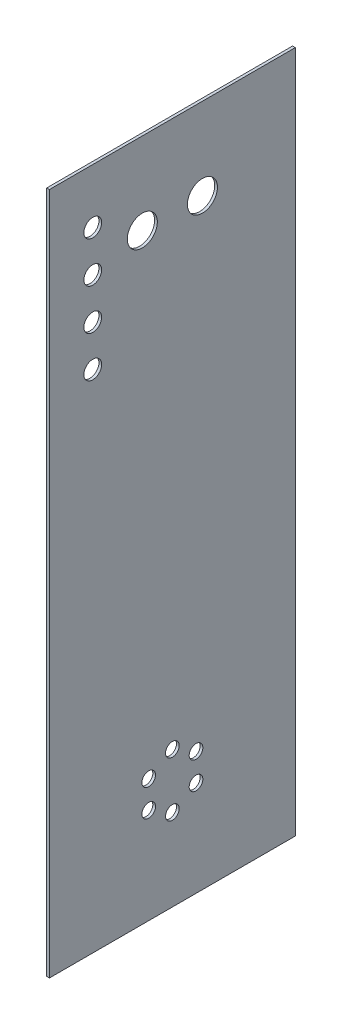
ISO-10303-21;
HEADER;
FILE_DESCRIPTION(('STEP AP214'),'2;1');
FILE_NAME('part.step','',(''),(''),'','','');
FILE_SCHEMA(('AUTOMOTIVE_DESIGN { 1 0 10303 214 1 1 1 1 }'));
ENDSEC;
DATA;
#1=APPLICATION_CONTEXT('core data for automotive mechanical design processes');
#2=APPLICATION_PROTOCOL_DEFINITION('international standard','automotive_design',2000,#1);
#3=PRODUCT_CONTEXT('',#1,'mechanical');
#4=PRODUCT('Part','Part','',(#3));
#5=PRODUCT_RELATED_PRODUCT_CATEGORY('part','',(#4));
#6=PRODUCT_DEFINITION_FORMATION('','',#4);
#7=PRODUCT_DEFINITION_CONTEXT('part definition',#1,'design');
#8=PRODUCT_DEFINITION('design','',#6,#7);
#9=PRODUCT_DEFINITION_SHAPE('','',#8);
#10=(LENGTH_UNIT() NAMED_UNIT(*) SI_UNIT(.MILLI.,.METRE.));
#11=(NAMED_UNIT(*) PLANE_ANGLE_UNIT() SI_UNIT($,.RADIAN.));
#12=(NAMED_UNIT(*) SI_UNIT($,.STERADIAN.) SOLID_ANGLE_UNIT());
#13=UNCERTAINTY_MEASURE_WITH_UNIT(LENGTH_MEASURE(1.E-05),#10,'distance_accuracy_value','');
#14=(GEOMETRIC_REPRESENTATION_CONTEXT(3) GLOBAL_UNCERTAINTY_ASSIGNED_CONTEXT((#13)) GLOBAL_UNIT_ASSIGNED_CONTEXT((#10,
#11,#12)) REPRESENTATION_CONTEXT('',''));
#15=CARTESIAN_POINT('',(0.,0.,0.));
#16=DIRECTION('',(0.,0.,1.));
#17=DIRECTION('',(1.,0.,0.));
#18=AXIS2_PLACEMENT_3D('',#15,#16,#17);
#19=CARTESIAN_POINT('',(-248.,250.,-133.832293437024));
#20=DIRECTION('',(1.,0.,0.));
#21=DIRECTION('',(0.,0.,-1.));
#22=AXIS2_PLACEMENT_3D('',#19,#20,#21);
#23=PLANE('',#22);
#24=DIRECTION('',(0.,0.,1.));
#25=VECTOR('',#24,1.);
#26=CARTESIAN_POINT('',(-248.,-250.,0.));
#27=LINE('',#26,#25);
#28=CARTESIAN_POINT('',(-248.,-250.,-90.));
#29=VERTEX_POINT('',#28);
#30=CARTESIAN_POINT('',(-248.,-250.,90.));
#31=VERTEX_POINT('',#30);
#32=EDGE_CURVE('E39',#29,#31,#27,.T.);
#33=ORIENTED_EDGE('',*,*,#32,.F.);
#34=DIRECTION('',(0.,1.,0.));
#35=VECTOR('',#34,1.);
#36=CARTESIAN_POINT('',(-248.,250.,-90.));
#37=LINE('',#36,#35);
#38=CARTESIAN_POINT('',(-248.,250.,-90.));
#39=VERTEX_POINT('',#38);
#40=EDGE_CURVE('E83',#29,#39,#37,.T.);
#41=ORIENTED_EDGE('',*,*,#40,.T.);
#42=DIRECTION('',(0.,0.,1.));
#43=VECTOR('',#42,1.);
#44=CARTESIAN_POINT('',(-248.,250.,0.));
#45=LINE('',#44,#43);
#46=CARTESIAN_POINT('',(-248.,250.,90.));
#47=VERTEX_POINT('',#46);
#48=EDGE_CURVE('E91',#39,#47,#45,.T.);
#49=ORIENTED_EDGE('',*,*,#48,.T.);
#50=DIRECTION('',(0.,-1.,0.));
#51=VECTOR('',#50,1.);
#52=CARTESIAN_POINT('',(-248.,250.,90.));
#53=LINE('',#52,#51);
#54=EDGE_CURVE('E92',#47,#31,#53,.T.);
#55=ORIENTED_EDGE('',*,*,#54,.T.);
#56=EDGE_LOOP('',(#33,#41,#49,#55));
#57=FACE_BOUND('',#56,.T.);
#58=CARTESIAN_POINT('',(-248.,-160.,17.3205080756886));
#59=DIRECTION('',(1.,0.,0.));
#60=DIRECTION('',(0.,0.,-1.));
#61=AXIS2_PLACEMENT_3D('',#58,#59,#60);
#62=CIRCLE('',#61,5.00000000000001);
#63=CARTESIAN_POINT('',(-248.,-160.,12.3205080756886));
#64=VERTEX_POINT('',#63);
#65=EDGE_CURVE('E122',#64,#64,#62,.T.);
#66=ORIENTED_EDGE('',*,*,#65,.F.);
#67=EDGE_LOOP('',(#66));
#68=FACE_BOUND('',#67,.T.);
#69=CARTESIAN_POINT('',(-248.,-180.,17.3205080756888));
#70=DIRECTION('',(1.,0.,0.));
#71=DIRECTION('',(0.,0.,-1.));
#72=AXIS2_PLACEMENT_3D('',#69,#70,#71);
#73=CIRCLE('',#72,5.00000000000001);
#74=CARTESIAN_POINT('',(-248.,-180.,12.3205080756888));
#75=VERTEX_POINT('',#74);
#76=EDGE_CURVE('E174',#75,#75,#73,.T.);
#77=ORIENTED_EDGE('',*,*,#76,.F.);
#78=EDGE_LOOP('',(#77));
#79=FACE_BOUND('',#78,.T.);
#80=CARTESIAN_POINT('',(-248.,-190.,0.));
#81=DIRECTION('',(1.,0.,0.));
#82=DIRECTION('',(0.,0.,-1.));
#83=AXIS2_PLACEMENT_3D('',#80,#81,#82);
#84=CIRCLE('',#83,5.00000000000001);
#85=CARTESIAN_POINT('',(-248.,-190.,-5.00000000000001));
#86=VERTEX_POINT('',#85);
#87=EDGE_CURVE('E171',#86,#86,#84,.T.);
#88=ORIENTED_EDGE('',*,*,#87,.F.);
#89=EDGE_LOOP('',(#88));
#90=FACE_BOUND('',#89,.T.);
#91=CARTESIAN_POINT('',(-248.,-180.,-17.3205080756887));
#92=DIRECTION('',(1.,0.,0.));
#93=DIRECTION('',(0.,0.,-1.));
#94=AXIS2_PLACEMENT_3D('',#91,#92,#93);
#95=CIRCLE('',#94,5.00000000000001);
#96=CARTESIAN_POINT('',(-248.,-180.,-22.3205080756887));
#97=VERTEX_POINT('',#96);
#98=EDGE_CURVE('E168',#97,#97,#95,.T.);
#99=ORIENTED_EDGE('',*,*,#98,.F.);
#100=EDGE_LOOP('',(#99));
#101=FACE_BOUND('',#100,.T.);
#102=CARTESIAN_POINT('',(-248.,-160.,-17.3205080756888));
#103=DIRECTION('',(1.,0.,0.));
#104=DIRECTION('',(0.,0.,-1.));
#105=AXIS2_PLACEMENT_3D('',#102,#103,#104);
#106=CIRCLE('',#105,5.00000000000001);
#107=CARTESIAN_POINT('',(-248.,-160.,-22.3205080756888));
#108=VERTEX_POINT('',#107);
#109=EDGE_CURVE('E118',#108,#108,#106,.T.);
#110=ORIENTED_EDGE('',*,*,#109,.F.);
#111=EDGE_LOOP('',(#110));
#112=FACE_BOUND('',#111,.T.);
#113=CARTESIAN_POINT('',(-248.,-150.,0.));
#114=DIRECTION('',(1.,0.,0.));
#115=DIRECTION('',(0.,0.,-1.));
#116=AXIS2_PLACEMENT_3D('',#113,#114,#115);
#117=CIRCLE('',#116,5.00000000000001);
#118=CARTESIAN_POINT('',(-248.,-150.,-5.00000000000001));
#119=VERTEX_POINT('',#118);
#120=EDGE_CURVE('E123',#119,#119,#117,.T.);
#121=ORIENTED_EDGE('',*,*,#120,.F.);
#122=EDGE_LOOP('',(#121));
#123=FACE_BOUND('',#122,.T.);
#124=CARTESIAN_POINT('',(-248.,120.,58.2924610892519));
#125=DIRECTION('',(-1.,0.,0.));
#126=DIRECTION('',(0.,0.,1.));
#127=AXIS2_PLACEMENT_3D('',#124,#125,#126);
#128=CIRCLE('',#127,6.5);
#129=CARTESIAN_POINT('',(-248.,120.,64.7924610892519));
#130=VERTEX_POINT('',#129);
#131=EDGE_CURVE('E137',#130,#130,#128,.T.);
#132=ORIENTED_EDGE('',*,*,#131,.T.);
#133=EDGE_LOOP('',(#132));
#134=FACE_BOUND('',#133,.T.);
#135=CARTESIAN_POINT('',(-248.,190.,-22.));
#136=DIRECTION('',(-1.,0.,0.));
#137=DIRECTION('',(0.,0.,-1.));
#138=AXIS2_PLACEMENT_3D('',#135,#136,#137);
#139=CIRCLE('',#138,11.);
#140=CARTESIAN_POINT('',(-248.,190.,-33.));
#141=VERTEX_POINT('',#140);
#142=EDGE_CURVE('E138',#141,#141,#139,.T.);
#143=ORIENTED_EDGE('',*,*,#142,.T.);
#144=EDGE_LOOP('',(#143));
#145=FACE_BOUND('',#144,.T.);
#146=CARTESIAN_POINT('',(-248.,210.,58.2924610892519));
#147=DIRECTION('',(-1.,0.,0.));
#148=DIRECTION('',(0.,0.,1.));
#149=AXIS2_PLACEMENT_3D('',#146,#147,#148);
#150=CIRCLE('',#149,6.5);
#151=CARTESIAN_POINT('',(-248.,210.,64.7924610892519));
#152=VERTEX_POINT('',#151);
#153=EDGE_CURVE('E145',#152,#152,#150,.T.);
#154=ORIENTED_EDGE('',*,*,#153,.T.);
#155=EDGE_LOOP('',(#154));
#156=FACE_BOUND('',#155,.T.);
#157=CARTESIAN_POINT('',(-248.,180.,58.2924610892519));
#158=DIRECTION('',(-1.,0.,0.));
#159=DIRECTION('',(0.,0.,1.));
#160=AXIS2_PLACEMENT_3D('',#157,#158,#159);
#161=CIRCLE('',#160,6.5);
#162=CARTESIAN_POINT('',(-248.,180.,64.7924610892519));
#163=VERTEX_POINT('',#162);
#164=EDGE_CURVE('E124',#163,#163,#161,.T.);
#165=ORIENTED_EDGE('',*,*,#164,.T.);
#166=EDGE_LOOP('',(#165));
#167=FACE_BOUND('',#166,.T.);
#168=CARTESIAN_POINT('',(-248.,150.,58.2924610892519));
#169=DIRECTION('',(-1.,0.,0.));
#170=DIRECTION('',(0.,0.,1.));
#171=AXIS2_PLACEMENT_3D('',#168,#169,#170);
#172=CIRCLE('',#171,6.5);
#173=CARTESIAN_POINT('',(-248.,150.,64.7924610892519));
#174=VERTEX_POINT('',#173);
#175=EDGE_CURVE('E131',#174,#174,#172,.T.);
#176=ORIENTED_EDGE('',*,*,#175,.T.);
#177=EDGE_LOOP('',(#176));
#178=FACE_BOUND('',#177,.T.);
#179=CARTESIAN_POINT('',(-248.,190.,22.));
#180=DIRECTION('',(-1.,0.,0.));
#181=DIRECTION('',(0.,0.,1.));
#182=AXIS2_PLACEMENT_3D('',#179,#180,#181);
#183=CIRCLE('',#182,11.);
#184=CARTESIAN_POINT('',(-248.,190.,33.));
#185=VERTEX_POINT('',#184);
#186=EDGE_CURVE('E106',#185,#185,#183,.T.);
#187=ORIENTED_EDGE('',*,*,#186,.T.);
#188=EDGE_LOOP('',(#187));
#189=FACE_BOUND('',#188,.T.);
#190=ADVANCED_FACE('F35',(#57,#68,#79,#90,#101,#112,#123,#134,#145,#156,#167,#178,#189),#23,.T.);
#191=CARTESIAN_POINT('',(-250.,250.,90.));
#192=DIRECTION('',(1.,0.,0.));
#193=DIRECTION('',(0.,0.,-1.));
#194=AXIS2_PLACEMENT_3D('',#191,#192,#193);
#195=PLANE('',#194);
#196=CARTESIAN_POINT('',(-250.,-160.,17.3205080756886));
#197=DIRECTION('',(-1.,0.,0.));
#198=DIRECTION('',(0.,-0.866025403784433,0.50000000000001));
#199=AXIS2_PLACEMENT_3D('',#196,#197,#198);
#200=CIRCLE('',#199,5.00000000000001);
#201=CARTESIAN_POINT('',(-250.,-164.330127018922,19.8205080756887));
#202=VERTEX_POINT('',#201);
#203=EDGE_CURVE('E11',#202,#202,#200,.T.);
#204=ORIENTED_EDGE('',*,*,#203,.F.);
#205=EDGE_LOOP('',(#204));
#206=FACE_BOUND('',#205,.T.);
#207=CARTESIAN_POINT('',(-250.,-180.,17.3205080756888));
#208=DIRECTION('',(-1.,0.,0.));
#209=DIRECTION('',(0.,-0.866025403784443,-0.499999999999992));
#210=AXIS2_PLACEMENT_3D('',#207,#208,#209);
#211=CIRCLE('',#210,5.00000000000001);
#212=CARTESIAN_POINT('',(-250.,-184.330127018922,14.8205080756889));
#213=VERTEX_POINT('',#212);
#214=EDGE_CURVE('E45',#213,#213,#211,.T.);
#215=ORIENTED_EDGE('',*,*,#214,.F.);
#216=EDGE_LOOP('',(#215));
#217=FACE_BOUND('',#216,.T.);
#218=CARTESIAN_POINT('',(-250.,-190.,0.));
#219=DIRECTION('',(-1.,0.,0.));
#220=DIRECTION('',(0.,0.,-1.));
#221=AXIS2_PLACEMENT_3D('',#218,#219,#220);
#222=CIRCLE('',#221,5.00000000000001);
#223=CARTESIAN_POINT('',(-250.,-190.,-5.00000000000001));
#224=VERTEX_POINT('',#223);
#225=EDGE_CURVE('E110',#224,#224,#222,.T.);
#226=ORIENTED_EDGE('',*,*,#225,.F.);
#227=EDGE_LOOP('',(#226));
#228=FACE_BOUND('',#227,.T.);
#229=CARTESIAN_POINT('',(-250.,-180.,-17.3205080756887));
#230=DIRECTION('',(-1.,0.,0.));
#231=DIRECTION('',(0.,0.866025403784436,-0.500000000000004));
#232=AXIS2_PLACEMENT_3D('',#229,#230,#231);
#233=CIRCLE('',#232,5.00000000000001);
#234=CARTESIAN_POINT('',(-250.,-175.669872981078,-19.8205080756887));
#235=VERTEX_POINT('',#234);
#236=EDGE_CURVE('E107',#235,#235,#233,.T.);
#237=ORIENTED_EDGE('',*,*,#236,.F.);
#238=EDGE_LOOP('',(#237));
#239=FACE_BOUND('',#238,.T.);
#240=CARTESIAN_POINT('',(-250.,-160.,-17.3205080756888));
#241=DIRECTION('',(-1.,0.,0.));
#242=DIRECTION('',(0.,0.86602540378444,0.499999999999998));
#243=AXIS2_PLACEMENT_3D('',#240,#241,#242);
#244=CIRCLE('',#243,5.00000000000001);
#245=CARTESIAN_POINT('',(-250.,-155.669872981078,-14.8205080756888));
#246=VERTEX_POINT('',#245);
#247=EDGE_CURVE('E111',#246,#246,#244,.T.);
#248=ORIENTED_EDGE('',*,*,#247,.F.);
#249=EDGE_LOOP('',(#248));
#250=FACE_BOUND('',#249,.T.);
#251=CARTESIAN_POINT('',(-250.,-150.,0.));
#252=DIRECTION('',(-1.,0.,0.));
#253=DIRECTION('',(0.,0.,1.));
#254=AXIS2_PLACEMENT_3D('',#251,#252,#253);
#255=CIRCLE('',#254,5.00000000000001);
#256=CARTESIAN_POINT('',(-250.,-150.,5.00000000000001));
#257=VERTEX_POINT('',#256);
#258=EDGE_CURVE('E119',#257,#257,#255,.T.);
#259=ORIENTED_EDGE('',*,*,#258,.F.);
#260=EDGE_LOOP('',(#259));
#261=FACE_BOUND('',#260,.T.);
#262=CARTESIAN_POINT('',(-250.,120.,58.2924610892519));
#263=DIRECTION('',(-1.,0.,0.));
#264=DIRECTION('',(0.,0.,1.));
#265=AXIS2_PLACEMENT_3D('',#262,#263,#264);
#266=CIRCLE('',#265,6.5);
#267=CARTESIAN_POINT('',(-250.,120.,64.7924610892519));
#268=VERTEX_POINT('',#267);
#269=EDGE_CURVE('E152',#268,#268,#266,.T.);
#270=ORIENTED_EDGE('',*,*,#269,.F.);
#271=EDGE_LOOP('',(#270));
#272=FACE_BOUND('',#271,.T.);
#273=CARTESIAN_POINT('',(-250.,190.,-22.));
#274=DIRECTION('',(-1.,0.,0.));
#275=DIRECTION('',(0.,0.,-1.));
#276=AXIS2_PLACEMENT_3D('',#273,#274,#275);
#277=CIRCLE('',#276,11.);
#278=CARTESIAN_POINT('',(-250.,190.,-33.));
#279=VERTEX_POINT('',#278);
#280=EDGE_CURVE('E141',#279,#279,#277,.T.);
#281=ORIENTED_EDGE('',*,*,#280,.F.);
#282=EDGE_LOOP('',(#281));
#283=FACE_BOUND('',#282,.T.);
#284=CARTESIAN_POINT('',(-250.,210.,58.2924610892519));
#285=DIRECTION('',(-1.,0.,0.));
#286=DIRECTION('',(0.,0.,1.));
#287=AXIS2_PLACEMENT_3D('',#284,#285,#286);
#288=CIRCLE('',#287,6.5);
#289=CARTESIAN_POINT('',(-250.,210.,64.7924610892519));
#290=VERTEX_POINT('',#289);
#291=EDGE_CURVE('E128',#290,#290,#288,.T.);
#292=ORIENTED_EDGE('',*,*,#291,.F.);
#293=EDGE_LOOP('',(#292));
#294=FACE_BOUND('',#293,.T.);
#295=CARTESIAN_POINT('',(-250.,180.,58.2924610892519));
#296=DIRECTION('',(-1.,0.,0.));
#297=DIRECTION('',(0.,0.,1.));
#298=AXIS2_PLACEMENT_3D('',#295,#296,#297);
#299=CIRCLE('',#298,6.5);
#300=CARTESIAN_POINT('',(-250.,180.,64.7924610892519));
#301=VERTEX_POINT('',#300);
#302=EDGE_CURVE('E127',#301,#301,#299,.T.);
#303=ORIENTED_EDGE('',*,*,#302,.F.);
#304=EDGE_LOOP('',(#303));
#305=FACE_BOUND('',#304,.T.);
#306=CARTESIAN_POINT('',(-250.,150.,58.2924610892519));
#307=DIRECTION('',(-1.,0.,0.));
#308=DIRECTION('',(0.,0.,1.));
#309=AXIS2_PLACEMENT_3D('',#306,#307,#308);
#310=CIRCLE('',#309,6.5);
#311=CARTESIAN_POINT('',(-250.,150.,64.7924610892519));
#312=VERTEX_POINT('',#311);
#313=EDGE_CURVE('E134',#312,#312,#310,.T.);
#314=ORIENTED_EDGE('',*,*,#313,.F.);
#315=EDGE_LOOP('',(#314));
#316=FACE_BOUND('',#315,.T.);
#317=CARTESIAN_POINT('',(-250.,190.,22.));
#318=DIRECTION('',(-1.,0.,0.));
#319=DIRECTION('',(0.,0.,1.));
#320=AXIS2_PLACEMENT_3D('',#317,#318,#319);
#321=CIRCLE('',#320,11.);
#322=CARTESIAN_POINT('',(-250.,190.,33.));
#323=VERTEX_POINT('',#322);
#324=EDGE_CURVE('E142',#323,#323,#321,.T.);
#325=ORIENTED_EDGE('',*,*,#324,.F.);
#326=EDGE_LOOP('',(#325));
#327=FACE_BOUND('',#326,.T.);
#328=DIRECTION('',(0.,0.,1.));
#329=VECTOR('',#328,1.);
#330=CARTESIAN_POINT('',(-250.,-250.,90.));
#331=LINE('',#330,#329);
#332=CARTESIAN_POINT('',(-250.,-250.,-90.));
#333=VERTEX_POINT('',#332);
#334=CARTESIAN_POINT('',(-250.,-250.,90.));
#335=VERTEX_POINT('',#334);
#336=EDGE_CURVE('E104',#333,#335,#331,.T.);
#337=ORIENTED_EDGE('',*,*,#336,.T.);
#338=DIRECTION('',(0.,-1.,0.));
#339=VECTOR('',#338,1.);
#340=CARTESIAN_POINT('',(-250.,250.,90.));
#341=LINE('',#340,#339);
#342=CARTESIAN_POINT('',(-250.,250.,90.));
#343=VERTEX_POINT('',#342);
#344=EDGE_CURVE('E100',#343,#335,#341,.T.);
#345=ORIENTED_EDGE('',*,*,#344,.F.);
#346=DIRECTION('',(0.,0.,1.));
#347=VECTOR('',#346,1.);
#348=CARTESIAN_POINT('',(-250.,250.,90.));
#349=LINE('',#348,#347);
#350=CARTESIAN_POINT('',(-250.,250.,-90.));
#351=VERTEX_POINT('',#350);
#352=EDGE_CURVE('E66',#351,#343,#349,.T.);
#353=ORIENTED_EDGE('',*,*,#352,.F.);
#354=DIRECTION('',(0.,-1.,0.));
#355=VECTOR('',#354,1.);
#356=CARTESIAN_POINT('',(-250.,250.,-90.));
#357=LINE('',#356,#355);
#358=EDGE_CURVE('E84',#351,#333,#357,.T.);
#359=ORIENTED_EDGE('',*,*,#358,.T.);
#360=EDGE_LOOP('',(#337,#345,#353,#359));
#361=FACE_BOUND('',#360,.T.);
#362=ADVANCED_FACE('F184',(#206,#217,#228,#239,#250,#261,#272,#283,#294,#305,#316,#327,#361),
#195,.F.);
#363=CARTESIAN_POINT('',(-245.,-160.,17.3205080756886));
#364=DIRECTION('',(-1.,0.,0.));
#365=DIRECTION('',(0.,0.,1.));
#366=AXIS2_PLACEMENT_3D('',#363,#364,#365);
#367=CYLINDRICAL_SURFACE('',#366,5.00000000000001);
#368=ORIENTED_EDGE('',*,*,#65,.T.);
#369=EDGE_LOOP('',(#368));
#370=FACE_BOUND('',#369,.T.);
#371=ORIENTED_EDGE('',*,*,#203,.T.);
#372=EDGE_LOOP('',(#371));
#373=FACE_BOUND('',#372,.T.);
#374=ADVANCED_FACE('F180',(#370,#373),#367,.F.);
#375=CARTESIAN_POINT('',(-245.,-180.,17.3205080756888));
#376=DIRECTION('',(-1.,0.,0.));
#377=DIRECTION('',(0.,0.,1.));
#378=AXIS2_PLACEMENT_3D('',#375,#376,#377);
#379=CYLINDRICAL_SURFACE('',#378,5.00000000000001);
#380=ORIENTED_EDGE('',*,*,#76,.T.);
#381=EDGE_LOOP('',(#380));
#382=FACE_BOUND('',#381,.T.);
#383=ORIENTED_EDGE('',*,*,#214,.T.);
#384=EDGE_LOOP('',(#383));
#385=FACE_BOUND('',#384,.T.);
#386=ADVANCED_FACE('F241',(#382,#385),#379,.F.);
#387=CARTESIAN_POINT('',(-245.,-190.,0.));
#388=DIRECTION('',(-1.,0.,0.));
#389=DIRECTION('',(0.,0.,1.));
#390=AXIS2_PLACEMENT_3D('',#387,#388,#389);
#391=CYLINDRICAL_SURFACE('',#390,5.00000000000001);
#392=ORIENTED_EDGE('',*,*,#87,.T.);
#393=EDGE_LOOP('',(#392));
#394=FACE_BOUND('',#393,.T.);
#395=ORIENTED_EDGE('',*,*,#225,.T.);
#396=EDGE_LOOP('',(#395));
#397=FACE_BOUND('',#396,.T.);
#398=ADVANCED_FACE('F237',(#394,#397),#391,.F.);
#399=CARTESIAN_POINT('',(-245.,-180.,-17.3205080756887));
#400=DIRECTION('',(-1.,0.,0.));
#401=DIRECTION('',(0.,0.,1.));
#402=AXIS2_PLACEMENT_3D('',#399,#400,#401);
#403=CYLINDRICAL_SURFACE('',#402,5.00000000000001);
#404=ORIENTED_EDGE('',*,*,#98,.T.);
#405=EDGE_LOOP('',(#404));
#406=FACE_BOUND('',#405,.T.);
#407=ORIENTED_EDGE('',*,*,#236,.T.);
#408=EDGE_LOOP('',(#407));
#409=FACE_BOUND('',#408,.T.);
#410=ADVANCED_FACE('F233',(#406,#409),#403,.F.);
#411=CARTESIAN_POINT('',(-245.,-160.,-17.3205080756888));
#412=DIRECTION('',(-1.,0.,0.));
#413=DIRECTION('',(0.,0.,1.));
#414=AXIS2_PLACEMENT_3D('',#411,#412,#413);
#415=CYLINDRICAL_SURFACE('',#414,5.00000000000001);
#416=ORIENTED_EDGE('',*,*,#109,.T.);
#417=EDGE_LOOP('',(#416));
#418=FACE_BOUND('',#417,.T.);
#419=ORIENTED_EDGE('',*,*,#247,.T.);
#420=EDGE_LOOP('',(#419));
#421=FACE_BOUND('',#420,.T.);
#422=ADVANCED_FACE('F236',(#418,#421),#415,.F.);
#423=CARTESIAN_POINT('',(-245.,-150.,0.));
#424=DIRECTION('',(-1.,0.,0.));
#425=DIRECTION('',(0.,0.,1.));
#426=AXIS2_PLACEMENT_3D('',#423,#424,#425);
#427=CYLINDRICAL_SURFACE('',#426,5.00000000000001);
#428=ORIENTED_EDGE('',*,*,#120,.T.);
#429=EDGE_LOOP('',(#428));
#430=FACE_BOUND('',#429,.T.);
#431=ORIENTED_EDGE('',*,*,#258,.T.);
#432=EDGE_LOOP('',(#431));
#433=FACE_BOUND('',#432,.T.);
#434=ADVANCED_FACE('F250',(#430,#433),#427,.F.);
#435=CARTESIAN_POINT('',(-248.,120.,58.2924610892519));
#436=DIRECTION('',(-1.,0.,0.));
#437=DIRECTION('',(0.,0.,1.));
#438=AXIS2_PLACEMENT_3D('',#435,#436,#437);
#439=CYLINDRICAL_SURFACE('',#438,6.5);
#440=ORIENTED_EDGE('',*,*,#131,.F.);
#441=EDGE_LOOP('',(#440));
#442=FACE_BOUND('',#441,.T.);
#443=ORIENTED_EDGE('',*,*,#269,.T.);
#444=EDGE_LOOP('',(#443));
#445=FACE_BOUND('',#444,.T.);
#446=ADVANCED_FACE('F254',(#442,#445),#439,.F.);
#447=CARTESIAN_POINT('',(-248.,190.,-22.));
#448=DIRECTION('',(-1.,0.,0.));
#449=DIRECTION('',(0.,0.,1.));
#450=AXIS2_PLACEMENT_3D('',#447,#448,#449);
#451=CYLINDRICAL_SURFACE('',#450,11.);
#452=ORIENTED_EDGE('',*,*,#142,.F.);
#453=EDGE_LOOP('',(#452));
#454=FACE_BOUND('',#453,.T.);
#455=ORIENTED_EDGE('',*,*,#280,.T.);
#456=EDGE_LOOP('',(#455));
#457=FACE_BOUND('',#456,.T.);
#458=ADVANCED_FACE('F264',(#454,#457),#451,.F.);
#459=CARTESIAN_POINT('',(-248.,210.,58.2924610892519));
#460=DIRECTION('',(-1.,0.,0.));
#461=DIRECTION('',(0.,0.,1.));
#462=AXIS2_PLACEMENT_3D('',#459,#460,#461);
#463=CYLINDRICAL_SURFACE('',#462,6.5);
#464=ORIENTED_EDGE('',*,*,#153,.F.);
#465=EDGE_LOOP('',(#464));
#466=FACE_BOUND('',#465,.T.);
#467=ORIENTED_EDGE('',*,*,#291,.T.);
#468=EDGE_LOOP('',(#467));
#469=FACE_BOUND('',#468,.T.);
#470=ADVANCED_FACE('F259',(#466,#469),#463,.F.);
#471=CARTESIAN_POINT('',(-248.,180.,58.2924610892519));
#472=DIRECTION('',(-1.,0.,0.));
#473=DIRECTION('',(0.,0.,1.));
#474=AXIS2_PLACEMENT_3D('',#471,#472,#473);
#475=CYLINDRICAL_SURFACE('',#474,6.5);
#476=ORIENTED_EDGE('',*,*,#164,.F.);
#477=EDGE_LOOP('',(#476));
#478=FACE_BOUND('',#477,.T.);
#479=ORIENTED_EDGE('',*,*,#302,.T.);
#480=EDGE_LOOP('',(#479));
#481=FACE_BOUND('',#480,.T.);
#482=ADVANCED_FACE('F256',(#478,#481),#475,.F.);
#483=CARTESIAN_POINT('',(-248.,150.,58.2924610892519));
#484=DIRECTION('',(-1.,0.,0.));
#485=DIRECTION('',(0.,0.,1.));
#486=AXIS2_PLACEMENT_3D('',#483,#484,#485);
#487=CYLINDRICAL_SURFACE('',#486,6.5);
#488=ORIENTED_EDGE('',*,*,#175,.F.);
#489=EDGE_LOOP('',(#488));
#490=FACE_BOUND('',#489,.T.);
#491=ORIENTED_EDGE('',*,*,#313,.T.);
#492=EDGE_LOOP('',(#491));
#493=FACE_BOUND('',#492,.T.);
#494=ADVANCED_FACE('F212',(#490,#493),#487,.F.);
#495=CARTESIAN_POINT('',(-248.,190.,22.));
#496=DIRECTION('',(-1.,0.,0.));
#497=DIRECTION('',(0.,0.,1.));
#498=AXIS2_PLACEMENT_3D('',#495,#496,#497);
#499=CYLINDRICAL_SURFACE('',#498,11.);
#500=ORIENTED_EDGE('',*,*,#186,.F.);
#501=EDGE_LOOP('',(#500));
#502=FACE_BOUND('',#501,.T.);
#503=ORIENTED_EDGE('',*,*,#324,.T.);
#504=EDGE_LOOP('',(#503));
#505=FACE_BOUND('',#504,.T.);
#506=ADVANCED_FACE('F208',(#502,#505),#499,.F.);
#507=CARTESIAN_POINT('',(-250.,250.,90.));
#508=DIRECTION('',(0.,0.,-1.));
#509=DIRECTION('',(-1.,0.,0.));
#510=AXIS2_PLACEMENT_3D('',#507,#508,#509);
#511=PLANE('',#510);
#512=ORIENTED_EDGE('',*,*,#54,.F.);
#513=DIRECTION('',(1.,0.,0.));
#514=VECTOR('',#513,1.);
#515=CARTESIAN_POINT('',(-250.,250.,90.));
#516=LINE('',#515,#514);
#517=EDGE_CURVE('E95',#343,#47,#516,.T.);
#518=ORIENTED_EDGE('',*,*,#517,.F.);
#519=ORIENTED_EDGE('',*,*,#344,.T.);
#520=DIRECTION('',(1.,0.,0.));
#521=VECTOR('',#520,1.);
#522=CARTESIAN_POINT('',(-250.,-250.,90.));
#523=LINE('',#522,#521);
#524=EDGE_CURVE('E86',#335,#31,#523,.T.);
#525=ORIENTED_EDGE('',*,*,#524,.T.);
#526=EDGE_LOOP('',(#512,#518,#519,#525));
#527=FACE_BOUND('',#526,.T.);
#528=ADVANCED_FACE('F211',(#527),#511,.F.);
#529=CARTESIAN_POINT('',(-250.,250.,-90.));
#530=DIRECTION('',(0.,0.,1.));
#531=DIRECTION('',(1.,0.,0.));
#532=AXIS2_PLACEMENT_3D('',#529,#530,#531);
#533=PLANE('',#532);
#534=ORIENTED_EDGE('',*,*,#40,.F.);
#535=DIRECTION('',(-1.,0.,0.));
#536=VECTOR('',#535,1.);
#537=CARTESIAN_POINT('',(-250.,-250.,-90.));
#538=LINE('',#537,#536);
#539=EDGE_CURVE('E54',#29,#333,#538,.T.);
#540=ORIENTED_EDGE('',*,*,#539,.T.);
#541=ORIENTED_EDGE('',*,*,#358,.F.);
#542=DIRECTION('',(-1.,0.,0.));
#543=VECTOR('',#542,1.);
#544=CARTESIAN_POINT('',(-250.,250.,-90.));
#545=LINE('',#544,#543);
#546=EDGE_CURVE('E80',#39,#351,#545,.T.);
#547=ORIENTED_EDGE('',*,*,#546,.F.);
#548=EDGE_LOOP('',(#534,#540,#541,#547));
#549=FACE_BOUND('',#548,.T.);
#550=ADVANCED_FACE('F82',(#549),#533,.F.);
#551=CARTESIAN_POINT('',(0.,-250.,0.));
#552=DIRECTION('',(0.,-1.,0.));
#553=DIRECTION('',(0.,0.,-1.));
#554=AXIS2_PLACEMENT_3D('',#551,#552,#553);
#555=PLANE('',#554);
#556=ORIENTED_EDGE('',*,*,#539,.F.);
#557=ORIENTED_EDGE('',*,*,#32,.T.);
#558=ORIENTED_EDGE('',*,*,#524,.F.);
#559=ORIENTED_EDGE('',*,*,#336,.F.);
#560=EDGE_LOOP('',(#556,#557,#558,#559));
#561=FACE_BOUND('',#560,.T.);
#562=ADVANCED_FACE('F37',(#561),#555,.T.);
#563=CARTESIAN_POINT('',(0.,250.,0.));
#564=DIRECTION('',(0.,-1.,0.));
#565=DIRECTION('',(0.,0.,-1.));
#566=AXIS2_PLACEMENT_3D('',#563,#564,#565);
#567=PLANE('',#566);
#568=ORIENTED_EDGE('',*,*,#48,.F.);
#569=ORIENTED_EDGE('',*,*,#546,.T.);
#570=ORIENTED_EDGE('',*,*,#352,.T.);
#571=ORIENTED_EDGE('',*,*,#517,.T.);
#572=EDGE_LOOP('',(#568,#569,#570,#571));
#573=FACE_BOUND('',#572,.T.);
#574=ADVANCED_FACE('F93',(#573),#567,.F.);
#575=CLOSED_SHELL('',(#190,#362,#374,#386,#398,#410,#422,#434,#446,#458,#470,#482,#494,#506,
#528,#550,#562,#574));
#576=MANIFOLD_SOLID_BREP('B2',#575);
#577=ADVANCED_BREP_SHAPE_REPRESENTATION('',(#18,#576),#14);
#578=SHAPE_DEFINITION_REPRESENTATION(#9,#577);
ENDSEC;
END-ISO-10303-21;
